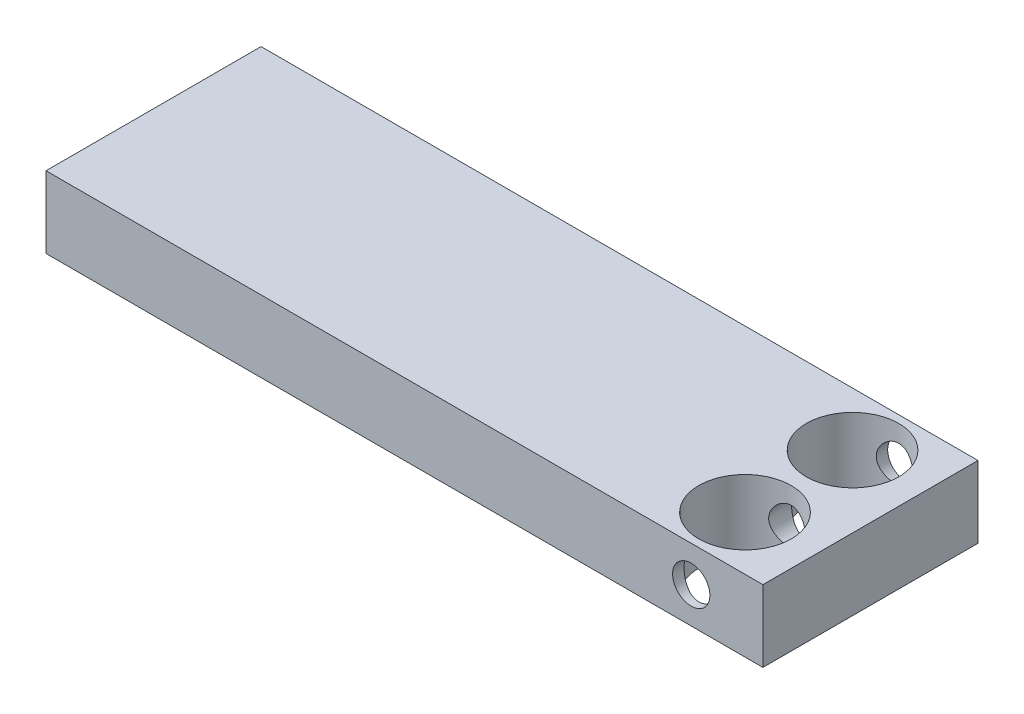
ISO-10303-21;
HEADER;
FILE_DESCRIPTION(('STEP AP214'),'2;1');
FILE_NAME('part.step','',(''),(''),'','','');
FILE_SCHEMA(('AUTOMOTIVE_DESIGN { 1 0 10303 214 1 1 1 1 }'));
ENDSEC;
DATA;
#1=APPLICATION_CONTEXT('core data for automotive mechanical design processes');
#2=APPLICATION_PROTOCOL_DEFINITION('international standard','automotive_design',2000,#1);
#3=PRODUCT_CONTEXT('',#1,'mechanical');
#4=PRODUCT('Part','Part','',(#3));
#5=PRODUCT_RELATED_PRODUCT_CATEGORY('part','',(#4));
#6=PRODUCT_DEFINITION_FORMATION('','',#4);
#7=PRODUCT_DEFINITION_CONTEXT('part definition',#1,'design');
#8=PRODUCT_DEFINITION('design','',#6,#7);
#9=PRODUCT_DEFINITION_SHAPE('','',#8);
#10=(LENGTH_UNIT() NAMED_UNIT(*) SI_UNIT(.MILLI.,.METRE.));
#11=(NAMED_UNIT(*) PLANE_ANGLE_UNIT() SI_UNIT($,.RADIAN.));
#12=(NAMED_UNIT(*) SI_UNIT($,.STERADIAN.) SOLID_ANGLE_UNIT());
#13=UNCERTAINTY_MEASURE_WITH_UNIT(LENGTH_MEASURE(1.E-05),#10,'distance_accuracy_value','');
#14=(GEOMETRIC_REPRESENTATION_CONTEXT(3) GLOBAL_UNCERTAINTY_ASSIGNED_CONTEXT((#13)) GLOBAL_UNIT_ASSIGNED_CONTEXT((#10,
#11,#12)) REPRESENTATION_CONTEXT('',''));
#15=CARTESIAN_POINT('',(0.,0.,0.));
#16=DIRECTION('',(0.,0.,1.));
#17=DIRECTION('',(1.,0.,0.));
#18=AXIS2_PLACEMENT_3D('',#15,#16,#17);
#19=CARTESIAN_POINT('',(0.,10.,0.));
#20=DIRECTION('',(0.,1.,0.));
#21=DIRECTION('',(0.,0.,1.));
#22=AXIS2_PLACEMENT_3D('',#19,#20,#21);
#23=PLANE('',#22);
#24=CARTESIAN_POINT('',(65.1891074130106,10.,-11.5695915279879));
#25=DIRECTION('',(0.,1.,0.));
#26=DIRECTION('',(0.,0.,1.));
#27=AXIS2_PLACEMENT_3D('',#24,#25,#26);
#28=CIRCLE('',#27,6.45);
#29=CARTESIAN_POINT('',(65.1891074130106,10.,-5.11959152798789));
#30=VERTEX_POINT('',#29);
#31=EDGE_CURVE('E126',#30,#30,#28,.T.);
#32=ORIENTED_EDGE('',*,*,#31,.F.);
#33=EDGE_LOOP('',(#32));
#34=FACE_BOUND('',#33,.T.);
#35=DIRECTION('',(0.,0.,1.));
#36=VECTOR('',#35,1.);
#37=CARTESIAN_POINT('',(-24.8108925869894,10.,-19.0695915279879));
#38=LINE('',#37,#36);
#39=CARTESIAN_POINT('',(-24.8108925869894,10.,-19.0695915279879));
#40=VERTEX_POINT('',#39);
#41=CARTESIAN_POINT('',(-24.8108925869894,10.,10.9304084720121));
#42=VERTEX_POINT('',#41);
#43=EDGE_CURVE('E105',#40,#42,#38,.T.);
#44=ORIENTED_EDGE('',*,*,#43,.T.);
#45=DIRECTION('',(1.,0.,0.));
#46=VECTOR('',#45,1.);
#47=CARTESIAN_POINT('',(-24.8108925869894,10.,10.9304084720121));
#48=LINE('',#47,#46);
#49=CARTESIAN_POINT('',(75.1891074130106,10.,10.9304084720121));
#50=VERTEX_POINT('',#49);
#51=EDGE_CURVE('E100',#42,#50,#48,.T.);
#52=ORIENTED_EDGE('',*,*,#51,.T.);
#53=DIRECTION('',(0.,0.,-1.));
#54=VECTOR('',#53,1.);
#55=CARTESIAN_POINT('',(75.1891074130106,10.,-19.0695915279879));
#56=LINE('',#55,#54);
#57=CARTESIAN_POINT('',(75.1891074130106,10.,-19.0695915279879));
#58=VERTEX_POINT('',#57);
#59=EDGE_CURVE('E103',#50,#58,#56,.T.);
#60=ORIENTED_EDGE('',*,*,#59,.T.);
#61=DIRECTION('',(-1.,0.,0.));
#62=VECTOR('',#61,1.);
#63=CARTESIAN_POINT('',(-24.8108925869894,10.,-19.0695915279879));
#64=LINE('',#63,#62);
#65=EDGE_CURVE('E70',#58,#40,#64,.T.);
#66=ORIENTED_EDGE('',*,*,#65,.T.);
#67=EDGE_LOOP('',(#44,#52,#60,#66));
#68=FACE_BOUND('',#67,.T.);
#69=CARTESIAN_POINT('',(65.1891074130106,10.,3.4304084720121));
#70=DIRECTION('',(0.,1.,0.));
#71=DIRECTION('',(0.,0.,1.));
#72=AXIS2_PLACEMENT_3D('',#69,#70,#71);
#73=CIRCLE('',#72,6.45);
#74=CARTESIAN_POINT('',(65.1891074130106,10.,9.88040847201211));
#75=VERTEX_POINT('',#74);
#76=EDGE_CURVE('E215',#75,#75,#73,.T.);
#77=ORIENTED_EDGE('',*,*,#76,.F.);
#78=EDGE_LOOP('',(#77));
#79=FACE_BOUND('',#78,.T.);
#80=ADVANCED_FACE('F45',(#34,#68,#79),#23,.T.);
#81=CARTESIAN_POINT('',(0.,0.,0.));
#82=DIRECTION('',(0.,1.,0.));
#83=DIRECTION('',(0.,0.,1.));
#84=AXIS2_PLACEMENT_3D('',#81,#82,#83);
#85=PLANE('',#84);
#86=DIRECTION('',(0.,0.,1.));
#87=VECTOR('',#86,1.);
#88=CARTESIAN_POINT('',(-24.8108925869894,0.,-19.0695915279879));
#89=LINE('',#88,#87);
#90=CARTESIAN_POINT('',(-24.8108925869894,0.,-19.0695915279879));
#91=VERTEX_POINT('',#90);
#92=CARTESIAN_POINT('',(-24.8108925869894,0.,10.9304084720121));
#93=VERTEX_POINT('',#92);
#94=EDGE_CURVE('E122',#91,#93,#89,.T.);
#95=ORIENTED_EDGE('',*,*,#94,.F.);
#96=DIRECTION('',(-1.,0.,0.));
#97=VECTOR('',#96,1.);
#98=CARTESIAN_POINT('',(-24.8108925869894,0.,-19.0695915279879));
#99=LINE('',#98,#97);
#100=CARTESIAN_POINT('',(75.1891074130106,0.,-19.0695915279879));
#101=VERTEX_POINT('',#100);
#102=EDGE_CURVE('E93',#101,#91,#99,.T.);
#103=ORIENTED_EDGE('',*,*,#102,.F.);
#104=DIRECTION('',(0.,0.,-1.));
#105=VECTOR('',#104,1.);
#106=CARTESIAN_POINT('',(75.1891074130106,0.,-19.0695915279879));
#107=LINE('',#106,#105);
#108=CARTESIAN_POINT('',(75.1891074130106,0.,10.9304084720121));
#109=VERTEX_POINT('',#108);
#110=EDGE_CURVE('E87',#109,#101,#107,.T.);
#111=ORIENTED_EDGE('',*,*,#110,.F.);
#112=DIRECTION('',(1.,0.,0.));
#113=VECTOR('',#112,1.);
#114=CARTESIAN_POINT('',(-24.8108925869894,0.,10.9304084720121));
#115=LINE('',#114,#113);
#116=EDGE_CURVE('E110',#93,#109,#115,.T.);
#117=ORIENTED_EDGE('',*,*,#116,.F.);
#118=EDGE_LOOP('',(#95,#103,#111,#117));
#119=FACE_BOUND('',#118,.T.);
#120=CARTESIAN_POINT('',(65.1891074130106,0.,-11.5695915279879));
#121=DIRECTION('',(0.,1.,0.));
#122=DIRECTION('',(0.,0.,1.));
#123=AXIS2_PLACEMENT_3D('',#120,#121,#122);
#124=CIRCLE('',#123,6.45);
#125=CARTESIAN_POINT('',(65.1891074130106,0.,-5.11959152798789));
#126=VERTEX_POINT('',#125);
#127=EDGE_CURVE('E221',#126,#126,#124,.T.);
#128=ORIENTED_EDGE('',*,*,#127,.T.);
#129=EDGE_LOOP('',(#128));
#130=FACE_BOUND('',#129,.T.);
#131=CARTESIAN_POINT('',(65.1891074130106,0.,3.4304084720121));
#132=DIRECTION('',(0.,1.,0.));
#133=DIRECTION('',(0.,0.,1.));
#134=AXIS2_PLACEMENT_3D('',#131,#132,#133);
#135=CIRCLE('',#134,6.45);
#136=CARTESIAN_POINT('',(65.1891074130106,0.,9.88040847201211));
#137=VERTEX_POINT('',#136);
#138=EDGE_CURVE('E212',#137,#137,#135,.T.);
#139=ORIENTED_EDGE('',*,*,#138,.T.);
#140=EDGE_LOOP('',(#139));
#141=FACE_BOUND('',#140,.T.);
#142=ADVANCED_FACE('F180',(#119,#130,#141),#85,.F.);
#143=CARTESIAN_POINT('',(-24.8108925869894,10.,-19.0695915279879));
#144=DIRECTION('',(1.,0.,0.));
#145=DIRECTION('',(0.,0.,-1.));
#146=AXIS2_PLACEMENT_3D('',#143,#144,#145);
#147=PLANE('',#146);
#148=ORIENTED_EDGE('',*,*,#94,.T.);
#149=DIRECTION('',(0.,-1.,0.));
#150=VECTOR('',#149,1.);
#151=CARTESIAN_POINT('',(-24.8108925869894,10.,10.9304084720121));
#152=LINE('',#151,#150);
#153=EDGE_CURVE('E11',#42,#93,#152,.T.);
#154=ORIENTED_EDGE('',*,*,#153,.F.);
#155=ORIENTED_EDGE('',*,*,#43,.F.);
#156=DIRECTION('',(0.,-1.,0.));
#157=VECTOR('',#156,1.);
#158=CARTESIAN_POINT('',(-24.8108925869894,10.,-19.0695915279879));
#159=LINE('',#158,#157);
#160=EDGE_CURVE('E118',#40,#91,#159,.T.);
#161=ORIENTED_EDGE('',*,*,#160,.T.);
#162=EDGE_LOOP('',(#148,#154,#155,#161));
#163=FACE_BOUND('',#162,.T.);
#164=ADVANCED_FACE('F47',(#163),#147,.F.);
#165=CARTESIAN_POINT('',(-24.8108925869894,10.,10.9304084720121));
#166=DIRECTION('',(0.,0.,-1.));
#167=DIRECTION('',(-1.,0.,0.));
#168=AXIS2_PLACEMENT_3D('',#165,#166,#167);
#169=PLANE('',#168);
#170=CARTESIAN_POINT('',(65.1891074130106,5.,10.9304084720121));
#171=DIRECTION('',(0.,0.,1.));
#172=DIRECTION('',(1.,0.,0.));
#173=AXIS2_PLACEMENT_3D('',#170,#171,#172);
#174=CIRCLE('',#173,2.6);
#175=CARTESIAN_POINT('',(67.7891074130106,5.,10.9304084720121));
#176=VERTEX_POINT('',#175);
#177=EDGE_CURVE('E165',#176,#176,#174,.T.);
#178=ORIENTED_EDGE('',*,*,#177,.F.);
#179=EDGE_LOOP('',(#178));
#180=FACE_BOUND('',#179,.T.);
#181=ORIENTED_EDGE('',*,*,#116,.T.);
#182=DIRECTION('',(0.,-1.,0.));
#183=VECTOR('',#182,1.);
#184=CARTESIAN_POINT('',(75.1891074130106,10.,10.9304084720121));
#185=LINE('',#184,#183);
#186=EDGE_CURVE('E61',#50,#109,#185,.T.);
#187=ORIENTED_EDGE('',*,*,#186,.F.);
#188=ORIENTED_EDGE('',*,*,#51,.F.);
#189=ORIENTED_EDGE('',*,*,#153,.T.);
#190=EDGE_LOOP('',(#181,#187,#188,#189));
#191=FACE_BOUND('',#190,.T.);
#192=ADVANCED_FACE('F109',(#180,#191),#169,.F.);
#193=CARTESIAN_POINT('',(75.1891074130106,10.,-19.0695915279879));
#194=DIRECTION('',(-1.,0.,0.));
#195=DIRECTION('',(0.,0.,1.));
#196=AXIS2_PLACEMENT_3D('',#193,#194,#195);
#197=PLANE('',#196);
#198=ORIENTED_EDGE('',*,*,#110,.T.);
#199=DIRECTION('',(0.,-1.,0.));
#200=VECTOR('',#199,1.);
#201=CARTESIAN_POINT('',(75.1891074130106,10.,-19.0695915279879));
#202=LINE('',#201,#200);
#203=EDGE_CURVE('E112',#58,#101,#202,.T.);
#204=ORIENTED_EDGE('',*,*,#203,.F.);
#205=ORIENTED_EDGE('',*,*,#59,.F.);
#206=ORIENTED_EDGE('',*,*,#186,.T.);
#207=EDGE_LOOP('',(#198,#204,#205,#206));
#208=FACE_BOUND('',#207,.T.);
#209=ADVANCED_FACE('F114',(#208),#197,.F.);
#210=CARTESIAN_POINT('',(-24.8108925869894,10.,-19.0695915279879));
#211=DIRECTION('',(0.,0.,1.));
#212=DIRECTION('',(1.,0.,0.));
#213=AXIS2_PLACEMENT_3D('',#210,#211,#212);
#214=PLANE('',#213);
#215=CARTESIAN_POINT('',(65.1891074130106,5.,-19.0695915279879));
#216=DIRECTION('',(0.,0.,1.));
#217=DIRECTION('',(1.,0.,0.));
#218=AXIS2_PLACEMENT_3D('',#215,#216,#217);
#219=CIRCLE('',#218,2.6);
#220=CARTESIAN_POINT('',(67.7891074130106,5.,-19.0695915279879));
#221=VERTEX_POINT('',#220);
#222=EDGE_CURVE('E142',#221,#221,#219,.T.);
#223=ORIENTED_EDGE('',*,*,#222,.T.);
#224=EDGE_LOOP('',(#223));
#225=FACE_BOUND('',#224,.T.);
#226=ORIENTED_EDGE('',*,*,#102,.T.);
#227=ORIENTED_EDGE('',*,*,#160,.F.);
#228=ORIENTED_EDGE('',*,*,#65,.F.);
#229=ORIENTED_EDGE('',*,*,#203,.T.);
#230=EDGE_LOOP('',(#226,#227,#228,#229));
#231=FACE_BOUND('',#230,.T.);
#232=ADVANCED_FACE('F175',(#225,#231),#214,.F.);
#233=CARTESIAN_POINT('',(65.1891074130106,10.,-11.5695915279879));
#234=DIRECTION('',(0.,-1.,0.));
#235=DIRECTION('',(0.,0.,-1.));
#236=AXIS2_PLACEMENT_3D('',#233,#234,#235);
#237=CYLINDRICAL_SURFACE('',#236,6.45);
#238=CARTESIAN_POINT('',(65.1891074130106,7.6,-18.0195915279879));
#239=CARTESIAN_POINT('',(65.049443953852,7.59999038205518,-18.0195843580053));
#240=CARTESIAN_POINT('',(64.9095571171709,7.58868190361171,-18.0150034801927));
#241=CARTESIAN_POINT('',(64.6337226361947,7.54385000863757,-17.997131215911));
#242=CARTESIAN_POINT('',(64.4977866604626,7.51026663301929,-17.9838163204712));
#243=CARTESIAN_POINT('',(64.234299894891,7.42230490553846,-17.949907052448));
#244=CARTESIAN_POINT('',(64.1067230799437,7.3679950780569,-17.9293366842168));
#245=CARTESIAN_POINT('',(63.8626080057299,7.24039717036633,-17.8829390925762));
#246=CARTESIAN_POINT('',(63.7460660230957,7.16711552300965,-17.8571136516598));
#247=CARTESIAN_POINT('',(63.5216013269245,6.999961359434,-17.8014351658519));
#248=CARTESIAN_POINT('',(63.4142737252579,6.90533207510747,-17.771455821893));
#249=CARTESIAN_POINT('',(63.2165068647384,6.69976662799704,-17.7114194154175));
#250=CARTESIAN_POINT('',(63.1260759812327,6.58882242668424,-17.681362321806));
#251=CARTESIAN_POINT('',(62.960627763423,6.34766760376749,-17.6230560018294));
#252=CARTESIAN_POINT('',(62.886495538866,6.21681137237152,-17.5949506019737));
#253=CARTESIAN_POINT('',(62.7615592921506,5.94318549034433,-17.5457151290368));
#254=CARTESIAN_POINT('',(62.7107440175874,5.80042162554914,-17.5245816927789));
#255=CARTESIAN_POINT('',(62.6363002936671,5.51387366656594,-17.4930408704263));
#256=CARTESIAN_POINT('',(62.6115313872506,5.37043695143929,-17.4821858232377));
#257=CARTESIAN_POINT('',(62.5863217819684,5.08106402109816,-17.4711350804457));
#258=CARTESIAN_POINT('',(62.5858688615339,4.93512909841648,-17.470934029989));
#259=CARTESIAN_POINT('',(62.6084407817256,4.65593369999567,-17.4808326670544));
#260=CARTESIAN_POINT('',(62.6298039418199,4.52250798222447,-17.4902033131464));
#261=CARTESIAN_POINT('',(62.6926278960884,4.26132657685323,-17.5169643409818));
#262=CARTESIAN_POINT('',(62.7340922579733,4.13357190018719,-17.5343561463535));
#263=CARTESIAN_POINT('',(62.8367349151368,3.88424953516467,-17.5755839625208));
#264=CARTESIAN_POINT('',(62.8983013412019,3.76286327088355,-17.5995452225451));
#265=CARTESIAN_POINT('',(63.0391276532907,3.53169384308052,-17.6511786598746));
#266=CARTESIAN_POINT('',(63.1183942487707,3.4219151028398,-17.678852242787));
#267=CARTESIAN_POINT('',(63.2996936754202,3.20799491897171,-17.73744138955));
#268=CARTESIAN_POINT('',(63.403026373815,3.10497510205692,-17.7684407910024));
#269=CARTESIAN_POINT('',(63.6258276909497,2.91736446848621,-17.8283416519687));
#270=CARTESIAN_POINT('',(63.745299615479,2.83277743670824,-17.8572426798044));
#271=CARTESIAN_POINT('',(64.0002109648098,2.68293035090452,-17.9104349103072));
#272=CARTESIAN_POINT('',(64.1359258075427,2.61809853864812,-17.9346203577483));
#273=CARTESIAN_POINT('',(64.4175579961948,2.51257330178059,-17.9748546585176));
#274=CARTESIAN_POINT('',(64.5634700322478,2.47186741751902,-17.9909077111352));
#275=CARTESIAN_POINT('',(64.8519582471226,2.4180324243259,-18.012299628453));
#276=CARTESIAN_POINT('',(64.9942099931984,2.40339637007281,-18.0182231196967));
#277=CARTESIAN_POINT('',(65.2792469080506,2.39765895008397,-18.0205345721821));
#278=CARTESIAN_POINT('',(65.4220319259364,2.40655136631826,-18.0169250527783));
#279=CARTESIAN_POINT('',(65.6972103846443,2.44651564696349,-18.0009581348049));
#280=CARTESIAN_POINT('',(65.8297802947438,2.47655343873652,-17.9890088029702));
#281=CARTESIAN_POINT('',(66.0878720654806,2.5565428899223,-17.9579895266322));
#282=CARTESIAN_POINT('',(66.2133930207913,2.60649710064067,-17.9389186698771));
#283=CARTESIAN_POINT('',(66.4581616127702,2.72653280691076,-17.894775301751));
#284=CARTESIAN_POINT('',(66.5770984028332,2.79718507198959,-17.869536529751));
#285=CARTESIAN_POINT('',(66.8018475132868,2.95597928984145,-17.815785890299));
#286=CARTESIAN_POINT('',(66.9076545011461,3.04412831120112,-17.7872727019705));
#287=CARTESIAN_POINT('',(67.1105833428669,3.24234015980941,-17.7277044774056));
#288=CARTESIAN_POINT('',(67.2066476601627,3.35347580481171,-17.6966071702805));
#289=CARTESIAN_POINT('',(67.3790293002472,3.59083075699924,-17.6371346067737));
#290=CARTESIAN_POINT('',(67.4553431554437,3.7170527072108,-17.6087598289364));
#291=CARTESIAN_POINT('',(67.5865996643826,3.9830248406539,-17.5578769165861));
#292=CARTESIAN_POINT('',(67.6413099429467,4.12290294784877,-17.5354333874922));
#293=CARTESIAN_POINT('',(67.725968349677,4.41106643119875,-17.4999358499431));
#294=CARTESIAN_POINT('',(67.7559351420714,4.55934538013498,-17.4868747651968));
#295=CARTESIAN_POINT('',(67.7884596780049,4.84845203882011,-17.4726546045068));
#296=CARTESIAN_POINT('',(67.7928564756204,4.98903481178427,-17.4706972015316));
#297=CARTESIAN_POINT('',(67.7789603350287,5.26883807785537,-17.4768091234438));
#298=CARTESIAN_POINT('',(67.7606703804531,5.40805874767155,-17.4848771298471));
#299=CARTESIAN_POINT('',(67.7034299141594,5.67536165887292,-17.5094218291222));
#300=CARTESIAN_POINT('',(67.665352500826,5.80366659880845,-17.5255421394483));
#301=CARTESIAN_POINT('',(67.5704416775437,6.05211432633003,-17.5641188497917));
#302=CARTESIAN_POINT('',(67.5136030702548,6.17225484102351,-17.586577005307));
#303=CARTESIAN_POINT('',(67.3789879300964,6.40853308097918,-17.6369108354267));
#304=CARTESIAN_POINT('',(67.3001908753141,6.52403782754706,-17.6650246525093));
#305=CARTESIAN_POINT('',(67.125378871435,6.74076203686455,-17.7227876387213));
#306=CARTESIAN_POINT('',(67.0293585860568,6.8419770548025,-17.7524372816658));
#307=CARTESIAN_POINT('',(66.8152414769772,7.03413649739573,-17.8122928618691));
#308=CARTESIAN_POINT('',(66.6961032555743,7.12395558230192,-17.8424054235132));
#309=CARTESIAN_POINT('',(66.4433472473467,7.282355522309,-17.8977925735713));
#310=CARTESIAN_POINT('',(66.3097227976417,7.35092654803047,-17.9230649208375));
#311=CARTESIAN_POINT('',(66.033991251297,7.46330470158073,-17.9655033180189));
#312=CARTESIAN_POINT('',(65.8920839658472,7.50754176081678,-17.9828091580173));
#313=CARTESIAN_POINT('',(65.6749045080477,7.55529109649309,-18.0016848086538));
#314=CARTESIAN_POINT('',(65.6018588872583,7.56810332989693,-18.0067947592734));
#315=CARTESIAN_POINT('',(65.4548229825672,7.5874453795977,-18.0145341780799));
#316=CARTESIAN_POINT('',(65.3808333985522,7.59397960424013,-18.0171653867854));
#317=CARTESIAN_POINT('',(65.2675408446318,7.5991141380437,-18.0192347771974));
#318=CARTESIAN_POINT('',(65.2283329389333,7.60000270127166,-18.0195935417311));
#319=CARTESIAN_POINT('',(65.1891074130106,7.6,-18.0195915279879));
#320=B_SPLINE_CURVE_WITH_KNOTS('',3,(#238,#239,#240,#241,#242,#243,#244,#245,#246,#247,#248,
#249,#250,#251,#252,#253,#254,#255,#256,#257,#258,#259,#260,#261,#262,#263,#264,#265,#266,#267,
#268,#269,#270,#271,#272,#273,#274,#275,#276,#277,#278,#279,#280,#281,#282,#283,#284,#285,#286,
#287,#288,#289,#290,#291,#292,#293,#294,#295,#296,#297,#298,#299,#300,#301,#302,#303,#304,#305,
#306,#307,#308,#309,#310,#311,#312,#313,#314,#315,#316,#317,#318,#319),.UNSPECIFIED.,.T.,.F.,(4,
2,2,2,2,2,2,2,2,2,2,2,2,2,2,2,2,2,2,2,2,2,2,2,2,2,2,2,2,2,2,2,2,2,2,2,2,2,2,2,4),(0.,
0.418858326151934,0.838848726759475,1.25746244707873,1.67593441181777,2.11260203339347,
2.54948553101387,3.00618397254462,3.46266178597057,3.89819456581586,4.33350843848996,
4.73797001017695,5.14250339500799,5.55536162095003,5.9683766121018,6.41386047177645,
6.85943571843233,7.31407662841736,7.76848253753773,8.19564651828704,8.62269762076302,
9.03019719641802,9.43774898980224,9.85781126699111,10.2780435935428,10.7264437075414,
11.1749224939023,11.6281017949149,12.0809389457233,12.5007605292068,12.9205269060164,
13.3231724715384,13.7259296741311,14.1519718080368,14.5781461714998,15.0325667126686,
15.4871971566108,15.9335136685707,16.1562736266749,16.3788770507334,16.4965165409007),.UNSPECIFIED.);
#321=CARTESIAN_POINT('',(65.1891074130106,7.6,-18.0195915279879));
#322=VERTEX_POINT('',#321);
#323=EDGE_CURVE('E164',#322,#322,#320,.T.);
#324=ORIENTED_EDGE('',*,*,#323,.F.);
#325=EDGE_LOOP('',(#324));
#326=FACE_BOUND('',#325,.T.);
#327=CARTESIAN_POINT('',(67.7891074130106,5.,-5.66683793326619));
#328=CARTESIAN_POINT('',(67.7891058259926,4.93039622589026,-5.66683659105084));
#329=CARTESIAN_POINT('',(67.7863064377443,4.86076733361563,-5.66560110426344));
#330=CARTESIAN_POINT('',(67.7751449531052,4.72202920294245,-5.66070513423825));
#331=CARTESIAN_POINT('',(67.7667792873088,4.6529203267836,-5.65704309496675));
#332=CARTESIAN_POINT('',(67.7333903866728,4.44686300764135,-5.64255475965501));
#333=CARTESIAN_POINT('',(67.7000755496985,4.31139821329843,-5.62822676517833));
#334=CARTESIAN_POINT('',(67.6128984495522,4.04904336574641,-5.59214123804025));
#335=CARTESIAN_POINT('',(67.5591162994591,3.9221221225568,-5.57041270692393));
#336=CARTESIAN_POINT('',(67.4327655515697,3.67911223953199,-5.52202487117607));
#337=CARTESIAN_POINT('',(67.360202238471,3.56302056492265,-5.49536695419087));
#338=CARTESIAN_POINT('',(67.1938342203719,3.33817875053167,-5.4383856616361));
#339=CARTESIAN_POINT('',(67.099111373906,3.23013828926417,-5.40794313746794));
#340=CARTESIAN_POINT('',(66.8930437695272,3.03095339599392,-5.34780600959959));
#341=CARTESIAN_POINT('',(66.7816928654231,2.93981523959622,-5.3181116872189));
#342=CARTESIAN_POINT('',(66.5400383091585,2.77349095357243,-5.26138453570245));
#343=CARTESIAN_POINT('',(66.4091533085589,2.69909197233702,-5.23450638090951));
#344=CARTESIAN_POINT('',(66.1354480953381,2.57367107400323,-5.18788583645197));
#345=CARTESIAN_POINT('',(65.9926328893796,2.52263940821131,-5.16814047176035));
#346=CARTESIAN_POINT('',(65.7065565034584,2.4479390000001,-5.13885342393188));
#347=CARTESIAN_POINT('',(65.5636612393948,2.42305020100064,-5.12885850331196));
#348=CARTESIAN_POINT('',(65.2753962663659,2.39741081965101,-5.11855880677416));
#349=CARTESIAN_POINT('',(65.1300275144753,2.39665110430951,-5.11825036447126));
#350=CARTESIAN_POINT('',(64.8497709307241,2.41862802901505,-5.12708422177769));
#351=CARTESIAN_POINT('',(64.7147581654071,2.44002716951666,-5.1356885594942));
#352=CARTESIAN_POINT('',(64.4504288997464,2.50343610538917,-5.16065354697405));
#353=CARTESIAN_POINT('',(64.3211128183399,2.545447413842,-5.17701476614552));
#354=CARTESIAN_POINT('',(64.0695083090568,2.64940163141033,-5.21620911005834));
#355=CARTESIAN_POINT('',(63.94735566079,2.71163623022827,-5.23913632663314));
#356=CARTESIAN_POINT('',(63.7149112895122,2.85399491426008,-5.28919318361042));
#357=CARTESIAN_POINT('',(63.604623677076,2.93412516993975,-5.31632427252784));
#358=CARTESIAN_POINT('',(63.3912465052019,3.11621333012426,-5.37417226565859));
#359=CARTESIAN_POINT('',(63.2891244462782,3.21926898424482,-5.40500764491262));
#360=CARTESIAN_POINT('',(63.1032117370748,3.44115447804794,-5.46540320412764));
#361=CARTESIAN_POINT('',(63.0194272779334,3.55998962351098,-5.49496295071384));
#362=CARTESIAN_POINT('',(62.8703062990834,3.81445269128155,-5.55027358526758));
#363=CARTESIAN_POINT('',(62.8055768546655,3.9504683521267,-5.57588877208968));
#364=CARTESIAN_POINT('',(62.7003282010056,4.23277697379599,-5.61881449411658));
#365=CARTESIAN_POINT('',(62.6597929766374,4.37906306436606,-5.63613052136935));
#366=CARTESIAN_POINT('',(62.6064565522163,4.66809990366188,-5.65915903133381));
#367=CARTESIAN_POINT('',(62.5920959877293,4.81051029687909,-5.66552256877082));
#368=CARTESIAN_POINT('',(62.5869626115139,5.09581719468189,-5.66778167519744));
#369=CARTESIAN_POINT('',(62.5961824704824,5.23871353443705,-5.66368049684679));
#370=CARTESIAN_POINT('',(62.63652779538,5.5121851947789,-5.6461412814451));
#371=CARTESIAN_POINT('',(62.6663465738066,5.64299347094675,-5.63326077670686));
#372=CARTESIAN_POINT('',(62.7453414905153,5.89765961446308,-5.60030965580591));
#373=CARTESIAN_POINT('',(62.7945219637004,6.02151591822957,-5.5802374295744));
#374=CARTESIAN_POINT('',(62.9130876634884,6.26441427744971,-5.5341607151619));
#375=CARTESIAN_POINT('',(62.9832170711336,6.38305217168714,-5.5079471542809));
#376=CARTESIAN_POINT('',(63.1409329432458,6.60742146812071,-5.45285618306634));
#377=CARTESIAN_POINT('',(63.2285266004614,6.71314752347716,-5.42397767780168));
#378=CARTESIAN_POINT('',(63.4264623287042,6.91696180428627,-5.36418751692306));
#379=CARTESIAN_POINT('',(63.5380200612119,7.0138769770192,-5.33328635631929));
#380=CARTESIAN_POINT('',(63.77654956188,7.18779864948334,-5.27497183079765));
#381=CARTESIAN_POINT('',(63.9035220481827,7.26480422114296,-5.24755862849867));
#382=CARTESIAN_POINT('',(64.1698023003659,7.39647027001733,-5.19920622302409));
#383=CARTESIAN_POINT('',(64.3091130152542,7.45112538753349,-5.17826857299623));
#384=CARTESIAN_POINT('',(64.5960048721061,7.53585620873891,-5.14529957504812));
#385=CARTESIAN_POINT('',(64.743581393711,7.56594550038312,-5.13326330390647));
#386=CARTESIAN_POINT('',(65.0322924518335,7.59906007277215,-5.11998632546349));
#387=CARTESIAN_POINT('',(65.1732078817726,7.60374304603838,-5.11808452955179));
#388=CARTESIAN_POINT('',(65.4537512032902,7.59030415205942,-5.12349695492731));
#389=CARTESIAN_POINT('',(65.5933792924638,7.57218584534272,-5.13080973731446));
#390=CARTESIAN_POINT('',(65.8628602605304,7.51484484827699,-5.1534956559538));
#391=CARTESIAN_POINT('',(65.9928825844937,7.4763065763059,-5.16860700201114));
#392=CARTESIAN_POINT('',(66.2445889450508,7.37994347024277,-5.2052650699778));
#393=CARTESIAN_POINT('',(66.3662713426169,7.32211485808885,-5.22681305243215));
#394=CARTESIAN_POINT('',(66.6037873615646,7.18592029624104,-5.27542520451977));
#395=CARTESIAN_POINT('',(66.7191208085767,7.10675592688043,-5.30269194568892));
#396=CARTESIAN_POINT('',(66.9353450463544,6.93133510811346,-5.35946505391593));
#397=CARTESIAN_POINT('',(67.0362309034898,6.835072845059,-5.38897218079267));
#398=CARTESIAN_POINT('',(67.2272784607839,6.62101759950107,-5.44921397335447));
#399=CARTESIAN_POINT('',(67.3163666895405,6.50225127781417,-5.47990913269188));
#400=CARTESIAN_POINT('',(67.473470077258,6.25049133148065,-5.53707973558937));
#401=CARTESIAN_POINT('',(67.541473823677,6.11749005399,-5.56355289012463));
#402=CARTESIAN_POINT('',(67.6535263647848,5.8417398179687,-5.60865151050292));
#403=CARTESIAN_POINT('',(67.697782134957,5.69908770321674,-5.62734445237249));
#404=CARTESIAN_POINT('',(67.7453734335789,5.4806981629438,-5.64774441755747));
#405=CARTESIAN_POINT('',(67.7581018960382,5.40723929233944,-5.65326950799169));
#406=CARTESIAN_POINT('',(67.777208931447,5.25936468014916,-5.66160127109101));
#407=CARTESIAN_POINT('',(67.7835922207705,5.18494969098617,-5.66440996281619));
#408=CARTESIAN_POINT('',(67.7883263260083,5.07362560028069,-5.6664940655042));
#409=CARTESIAN_POINT('',(67.78910825245,5.0368163139072,-5.66683864321938));
#410=CARTESIAN_POINT('',(67.7891074130106,5.,-5.66683793326619));
#411=B_SPLINE_CURVE_WITH_KNOTS('',3,(#327,#328,#329,#330,#331,#332,#333,#334,#335,#336,#337,
#338,#339,#340,#341,#342,#343,#344,#345,#346,#347,#348,#349,#350,#351,#352,#353,#354,#355,#356,
#357,#358,#359,#360,#361,#362,#363,#364,#365,#366,#367,#368,#369,#370,#371,#372,#373,#374,#375,
#376,#377,#378,#379,#380,#381,#382,#383,#384,#385,#386,#387,#388,#389,#390,#391,#392,#393,#394,
#395,#396,#397,#398,#399,#400,#401,#402,#403,#404,#405,#406,#407,#408,#409,#410),.UNSPECIFIED.,
.T.,.F.,(4,2,2,2,2,2,2,2,2,2,2,2,2,2,2,2,2,2,2,2,2,2,2,2,2,2,2,2,2,2,2,2,2,2,2,2,2,2,2,2,2,4),
(0.,0.20878025038681,0.417694511436456,0.836157397968941,1.25299891058499,1.66972325841475,
2.10841662826191,2.54727255455877,3.00374397766062,3.46002478992618,3.89391110017773,
4.32763318010816,4.73662058428681,5.14563801558647,5.56083821872573,5.97618180553607,
6.41916683088422,6.86230118686253,7.31831727587143,7.77403117378064,8.20157763136727,
8.6289912144668,9.03151907271619,9.43413710449764,9.85322411010326,10.272484076908,
10.7232866906059,11.1741103143531,11.6250419835029,12.0757240620905,12.4966116075007,
12.9174334374697,13.3249681233629,13.7325826728628,14.158310207234,14.5841827761211,
15.036838657487,15.4897391249748,15.93862544347,16.1626374861386,16.3864828956206,
16.4969154021072),.UNSPECIFIED.);
#412=CARTESIAN_POINT('',(67.7891074130106,5.,-5.66683793326619));
#413=VERTEX_POINT('',#412);
#414=EDGE_CURVE('E157',#413,#413,#411,.T.);
#415=ORIENTED_EDGE('',*,*,#414,.F.);
#416=EDGE_LOOP('',(#415));
#417=FACE_BOUND('',#416,.T.);
#418=ORIENTED_EDGE('',*,*,#31,.T.);
#419=EDGE_LOOP('',(#418));
#420=FACE_BOUND('',#419,.T.);
#421=ORIENTED_EDGE('',*,*,#127,.F.);
#422=EDGE_LOOP('',(#421));
#423=FACE_BOUND('',#422,.T.);
#424=ADVANCED_FACE('F171',(#326,#417,#420,#423),#237,.F.);
#425=CARTESIAN_POINT('',(65.1891074130106,10.,3.4304084720121));
#426=DIRECTION('',(0.,-1.,0.));
#427=DIRECTION('',(0.,0.,-1.));
#428=AXIS2_PLACEMENT_3D('',#425,#426,#427);
#429=CYLINDRICAL_SURFACE('',#428,6.45);
#430=CARTESIAN_POINT('',(65.1891074130106,7.6,-3.0195915279879));
#431=CARTESIAN_POINT('',(65.049443953852,7.59999038205518,-3.01958435800534));
#432=CARTESIAN_POINT('',(64.9095571171709,7.58868190361171,-3.0150034801927));
#433=CARTESIAN_POINT('',(64.6337226361947,7.54385000863757,-2.99713121591095));
#434=CARTESIAN_POINT('',(64.4977866604626,7.51026663301929,-2.98381632047119));
#435=CARTESIAN_POINT('',(64.234299894891,7.42230490553846,-2.94990705244801));
#436=CARTESIAN_POINT('',(64.1067230799437,7.3679950780569,-2.92933668421677));
#437=CARTESIAN_POINT('',(63.8626080057299,7.24039717036633,-2.88293909257623));
#438=CARTESIAN_POINT('',(63.7460660230957,7.16711552300965,-2.85711365165983));
#439=CARTESIAN_POINT('',(63.5216013269245,6.999961359434,-2.80143516585186));
#440=CARTESIAN_POINT('',(63.4142737252579,6.90533207510747,-2.771455821893));
#441=CARTESIAN_POINT('',(63.2165068647384,6.69976662799704,-2.71141941541748));
#442=CARTESIAN_POINT('',(63.1260759812327,6.58882242668424,-2.68136232180603));
#443=CARTESIAN_POINT('',(62.960627763423,6.34766760376749,-2.62305600182937));
#444=CARTESIAN_POINT('',(62.886495538866,6.21681137237152,-2.59495060197371));
#445=CARTESIAN_POINT('',(62.7615592921506,5.94318549034433,-2.54571512903684));
#446=CARTESIAN_POINT('',(62.7107440175874,5.80042162554914,-2.52458169277895));
#447=CARTESIAN_POINT('',(62.6363002936671,5.51387366656594,-2.4930408704263));
#448=CARTESIAN_POINT('',(62.6115313872506,5.37043695143929,-2.48218582323772));
#449=CARTESIAN_POINT('',(62.5863217819684,5.08106402109816,-2.47113508044574));
#450=CARTESIAN_POINT('',(62.5858688615339,4.93512909841648,-2.47093402998901));
#451=CARTESIAN_POINT('',(62.6084407817256,4.65593369999567,-2.48083266705438));
#452=CARTESIAN_POINT('',(62.6298039418199,4.52250798222447,-2.49020331314639));
#453=CARTESIAN_POINT('',(62.6926278960884,4.26132657685323,-2.51696434098176));
#454=CARTESIAN_POINT('',(62.7340922579733,4.13357190018719,-2.53435614635345));
#455=CARTESIAN_POINT('',(62.8367349151368,3.88424953516467,-2.57558396252085));
#456=CARTESIAN_POINT('',(62.898301341202,3.76286327088355,-2.5995452225451));
#457=CARTESIAN_POINT('',(63.0391276532908,3.53169384308052,-2.65117865987464));
#458=CARTESIAN_POINT('',(63.1183942487707,3.4219151028398,-2.67885224278697));
#459=CARTESIAN_POINT('',(63.2996936754202,3.2079949189717,-2.73744138954998));
#460=CARTESIAN_POINT('',(63.403026373815,3.10497510205692,-2.76844079100237));
#461=CARTESIAN_POINT('',(63.6258276909497,2.91736446848621,-2.82834165196872));
#462=CARTESIAN_POINT('',(63.745299615479,2.83277743670824,-2.85724267980435));
#463=CARTESIAN_POINT('',(64.0002109648098,2.68293035090452,-2.91043491030716));
#464=CARTESIAN_POINT('',(64.1359258075427,2.61809853864812,-2.93462035774835));
#465=CARTESIAN_POINT('',(64.4175579961948,2.51257330178059,-2.97485465851755));
#466=CARTESIAN_POINT('',(64.5634700322478,2.47186741751902,-2.99090771113515));
#467=CARTESIAN_POINT('',(64.8519582471226,2.4180324243259,-3.01229962845299));
#468=CARTESIAN_POINT('',(64.9942099931985,2.40339637007281,-3.01822311969667));
#469=CARTESIAN_POINT('',(65.2792469080506,2.39765895008397,-3.02053457218209));
#470=CARTESIAN_POINT('',(65.4220319259364,2.40655136631826,-3.01692505277826));
#471=CARTESIAN_POINT('',(65.6972103846443,2.44651564696349,-3.00095813480491));
#472=CARTESIAN_POINT('',(65.8297802947438,2.47655343873652,-2.98900880297019));
#473=CARTESIAN_POINT('',(66.0878720654806,2.5565428899223,-2.95798952663222));
#474=CARTESIAN_POINT('',(66.2133930207913,2.60649710064067,-2.93891866987705));
#475=CARTESIAN_POINT('',(66.4581616127702,2.72653280691076,-2.894775301751));
#476=CARTESIAN_POINT('',(66.5770984028332,2.79718507198959,-2.86953652975103));
#477=CARTESIAN_POINT('',(66.8018475132868,2.95597928984145,-2.81578589029902));
#478=CARTESIAN_POINT('',(66.9076545011461,3.04412831120112,-2.78727270197051));
#479=CARTESIAN_POINT('',(67.1105833428669,3.24234015980941,-2.72770447740557));
#480=CARTESIAN_POINT('',(67.2066476601627,3.35347580481171,-2.69660717028051));
#481=CARTESIAN_POINT('',(67.3790293002472,3.59083075699924,-2.63713460677368));
#482=CARTESIAN_POINT('',(67.4553431554437,3.71705270721081,-2.6087598289364));
#483=CARTESIAN_POINT('',(67.5865996643826,3.98302484065391,-2.55787691658615));
#484=CARTESIAN_POINT('',(67.6413099429467,4.12290294784877,-2.53543338749217));
#485=CARTESIAN_POINT('',(67.725968349677,4.41106643119875,-2.4999358499431));
#486=CARTESIAN_POINT('',(67.7559351420714,4.55934538013498,-2.48687476519676));
#487=CARTESIAN_POINT('',(67.7884596780049,4.84845203882011,-2.47265460450675));
#488=CARTESIAN_POINT('',(67.7928564756204,4.98903481178427,-2.47069720153163));
#489=CARTESIAN_POINT('',(67.7789603350287,5.26883807785537,-2.47680912344384));
#490=CARTESIAN_POINT('',(67.7606703804531,5.40805874767155,-2.48487712984708));
#491=CARTESIAN_POINT('',(67.7034299141594,5.67536165887292,-2.50942182912218));
#492=CARTESIAN_POINT('',(67.665352500826,5.80366659880845,-2.52554213944833));
#493=CARTESIAN_POINT('',(67.5704416775437,6.05211432633004,-2.56411884979169));
#494=CARTESIAN_POINT('',(67.5136030702548,6.17225484102351,-2.58657700530702));
#495=CARTESIAN_POINT('',(67.3789879300964,6.40853308097918,-2.6369108354267));
#496=CARTESIAN_POINT('',(67.3001908753141,6.52403782754706,-2.66502465250927));
#497=CARTESIAN_POINT('',(67.125378871435,6.74076203686455,-2.72278763872134));
#498=CARTESIAN_POINT('',(67.0293585860568,6.8419770548025,-2.75243728166579));
#499=CARTESIAN_POINT('',(66.8152414769772,7.03413649739573,-2.81229286186907));
#500=CARTESIAN_POINT('',(66.6961032555743,7.12395558230192,-2.84240542351318));
#501=CARTESIAN_POINT('',(66.4433472473467,7.282355522309,-2.89779257357129));
#502=CARTESIAN_POINT('',(66.3097227976417,7.35092654803047,-2.92306492083745));
#503=CARTESIAN_POINT('',(66.033991251297,7.46330470158073,-2.96550331801887));
#504=CARTESIAN_POINT('',(65.8920839658472,7.50754176081678,-2.9828091580173));
#505=CARTESIAN_POINT('',(65.6749045080477,7.55529109649309,-3.00168480865377));
#506=CARTESIAN_POINT('',(65.6018588872583,7.56810332989693,-3.0067947592734));
#507=CARTESIAN_POINT('',(65.4548229825672,7.5874453795977,-3.01453417807987));
#508=CARTESIAN_POINT('',(65.3808333985522,7.59397960424013,-3.01716538678541));
#509=CARTESIAN_POINT('',(65.2675408446318,7.5991141380437,-3.01923477719743));
#510=CARTESIAN_POINT('',(65.2283329389333,7.60000270127166,-3.01959354173107));
#511=CARTESIAN_POINT('',(65.1891074130106,7.6,-3.0195915279879));
#512=B_SPLINE_CURVE_WITH_KNOTS('',3,(#430,#431,#432,#433,#434,#435,#436,#437,#438,#439,#440,
#441,#442,#443,#444,#445,#446,#447,#448,#449,#450,#451,#452,#453,#454,#455,#456,#457,#458,#459,
#460,#461,#462,#463,#464,#465,#466,#467,#468,#469,#470,#471,#472,#473,#474,#475,#476,#477,#478,
#479,#480,#481,#482,#483,#484,#485,#486,#487,#488,#489,#490,#491,#492,#493,#494,#495,#496,#497,
#498,#499,#500,#501,#502,#503,#504,#505,#506,#507,#508,#509,#510,#511),.UNSPECIFIED.,.T.,.F.,(4,
2,2,2,2,2,2,2,2,2,2,2,2,2,2,2,2,2,2,2,2,2,2,2,2,2,2,2,2,2,2,2,2,2,2,2,2,2,2,2,4),(0.,
0.418858326151934,0.838848726759475,1.25746244707873,1.67593441181777,2.11260203339347,
2.54948553101387,3.00618397254462,3.46266178597057,3.89819456581586,4.33350843848996,
4.73797001017695,5.14250339500799,5.55536162095003,5.9683766121018,6.41386047177645,
6.85943571843233,7.31407662841736,7.76848253753773,8.19564651828704,8.62269762076302,
9.03019719641802,9.43774898980224,9.85781126699111,10.2780435935428,10.7264437075414,
11.1749224939023,11.6281017949149,12.0809389457233,12.5007605292068,12.9205269060164,
13.3231724715384,13.7259296741311,14.1519718080368,14.5781461714998,15.0325667126686,
15.4871971566108,15.9335136685707,16.1562736266749,16.3788770507334,16.4965165409007),.UNSPECIFIED.);
#513=CARTESIAN_POINT('',(65.1891074130106,7.6,-3.0195915279879));
#514=VERTEX_POINT('',#513);
#515=EDGE_CURVE('E49',#514,#514,#512,.T.);
#516=ORIENTED_EDGE('',*,*,#515,.F.);
#517=EDGE_LOOP('',(#516));
#518=FACE_BOUND('',#517,.T.);
#519=CARTESIAN_POINT('',(67.7891074130106,5.,9.33316206673381));
#520=CARTESIAN_POINT('',(67.7891058259926,4.93039622589026,9.33316340894916));
#521=CARTESIAN_POINT('',(67.7863064377443,4.86076733361563,9.33439889573656));
#522=CARTESIAN_POINT('',(67.7751449531052,4.72202920294244,9.33929486576175));
#523=CARTESIAN_POINT('',(67.7667792873088,4.6529203267836,9.34295690503325));
#524=CARTESIAN_POINT('',(67.7333903866728,4.44686300764134,9.35744524034499));
#525=CARTESIAN_POINT('',(67.7000755496985,4.31139821329843,9.37177323482167));
#526=CARTESIAN_POINT('',(67.6128984495522,4.04904336574641,9.40785876195975));
#527=CARTESIAN_POINT('',(67.5591162994591,3.9221221225568,9.42958729307607));
#528=CARTESIAN_POINT('',(67.4327655515697,3.67911223953199,9.47797512882393));
#529=CARTESIAN_POINT('',(67.360202238471,3.56302056492265,9.50463304580913));
#530=CARTESIAN_POINT('',(67.1938342203719,3.33817875053167,9.5616143383639));
#531=CARTESIAN_POINT('',(67.099111373906,3.23013828926417,9.59205686253206));
#532=CARTESIAN_POINT('',(66.8930437695272,3.03095339599392,9.65219399040041));
#533=CARTESIAN_POINT('',(66.7816928654231,2.93981523959622,9.6818883127811));
#534=CARTESIAN_POINT('',(66.5400383091585,2.77349095357243,9.73861546429755));
#535=CARTESIAN_POINT('',(66.4091533085589,2.69909197233702,9.76549361909049));
#536=CARTESIAN_POINT('',(66.1354480953381,2.57367107400323,9.81211416354803));
#537=CARTESIAN_POINT('',(65.9926328893796,2.52263940821131,9.83185952823965));
#538=CARTESIAN_POINT('',(65.7065565034584,2.4479390000001,9.86114657606812));
#539=CARTESIAN_POINT('',(65.5636612393948,2.42305020100064,9.87114149668804));
#540=CARTESIAN_POINT('',(65.2753962663659,2.39741081965101,9.88144119322584));
#541=CARTESIAN_POINT('',(65.1300275144753,2.39665110430951,9.88174963552874));
#542=CARTESIAN_POINT('',(64.8497709307241,2.41862802901505,9.87291577822231));
#543=CARTESIAN_POINT('',(64.7147581654071,2.44002716951666,9.8643114405058));
#544=CARTESIAN_POINT('',(64.4504288997464,2.50343610538917,9.83934645302595));
#545=CARTESIAN_POINT('',(64.3211128183399,2.545447413842,9.82298523385448));
#546=CARTESIAN_POINT('',(64.0695083090568,2.64940163141033,9.78379088994166));
#547=CARTESIAN_POINT('',(63.94735566079,2.71163623022827,9.76086367336686));
#548=CARTESIAN_POINT('',(63.7149112895122,2.85399491426009,9.71080681638958));
#549=CARTESIAN_POINT('',(63.604623677076,2.93412516993975,9.68367572747216));
#550=CARTESIAN_POINT('',(63.3912465052019,3.11621333012426,9.62582773434141));
#551=CARTESIAN_POINT('',(63.2891244462782,3.21926898424482,9.59499235508738));
#552=CARTESIAN_POINT('',(63.1032117370748,3.44115447804794,9.53459679587236));
#553=CARTESIAN_POINT('',(63.0194272779334,3.55998962351098,9.50503704928616));
#554=CARTESIAN_POINT('',(62.8703062990834,3.81445269128155,9.44972641473242));
#555=CARTESIAN_POINT('',(62.8055768546655,3.9504683521267,9.42411122791031));
#556=CARTESIAN_POINT('',(62.7003282010056,4.23277697379599,9.38118550588342));
#557=CARTESIAN_POINT('',(62.6597929766374,4.37906306436606,9.36386947863065));
#558=CARTESIAN_POINT('',(62.6064565522163,4.66809990366188,9.34084096866619));
#559=CARTESIAN_POINT('',(62.5920959877293,4.81051029687909,9.33447743122917));
#560=CARTESIAN_POINT('',(62.5869626115139,5.09581719468189,9.33221832480256));
#561=CARTESIAN_POINT('',(62.5961824704824,5.23871353443705,9.33631950315321));
#562=CARTESIAN_POINT('',(62.63652779538,5.5121851947789,9.3538587185549));
#563=CARTESIAN_POINT('',(62.6663465738066,5.64299347094675,9.36673922329314));
#564=CARTESIAN_POINT('',(62.7453414905153,5.89765961446308,9.39969034419409));
#565=CARTESIAN_POINT('',(62.7945219637004,6.02151591822957,9.4197625704256));
#566=CARTESIAN_POINT('',(62.9130876634884,6.26441427744971,9.4658392848381));
#567=CARTESIAN_POINT('',(62.9832170711336,6.38305217168714,9.4920528457191));
#568=CARTESIAN_POINT('',(63.1409329432458,6.60742146812071,9.54714381693366));
#569=CARTESIAN_POINT('',(63.2285266004614,6.71314752347716,9.57602232219832));
#570=CARTESIAN_POINT('',(63.4264623287042,6.91696180428627,9.63581248307694));
#571=CARTESIAN_POINT('',(63.5380200612119,7.0138769770192,9.66671364368071));
#572=CARTESIAN_POINT('',(63.77654956188,7.18779864948333,9.72502816920234));
#573=CARTESIAN_POINT('',(63.9035220481827,7.26480422114296,9.75244137150133));
#574=CARTESIAN_POINT('',(64.1698023003659,7.39647027001733,9.80079377697591));
#575=CARTESIAN_POINT('',(64.3091130152543,7.45112538753349,9.82173142700378));
#576=CARTESIAN_POINT('',(64.5960048721062,7.53585620873892,9.85470042495188));
#577=CARTESIAN_POINT('',(64.743581393711,7.56594550038312,9.86673669609353));
#578=CARTESIAN_POINT('',(65.0322924518335,7.59906007277215,9.88001367453651));
#579=CARTESIAN_POINT('',(65.1732078817726,7.60374304603838,9.88191547044821));
#580=CARTESIAN_POINT('',(65.4537512032902,7.59030415205942,9.87650304507269));
#581=CARTESIAN_POINT('',(65.5933792924638,7.57218584534272,9.86919026268554));
#582=CARTESIAN_POINT('',(65.8628602605304,7.51484484827699,9.8465043440462));
#583=CARTESIAN_POINT('',(65.9928825844937,7.4763065763059,9.83139299798886));
#584=CARTESIAN_POINT('',(66.2445889450508,7.37994347024277,9.7947349300222));
#585=CARTESIAN_POINT('',(66.3662713426169,7.32211485808885,9.77318694756785));
#586=CARTESIAN_POINT('',(66.6037873615646,7.18592029624104,9.72457479548022));
#587=CARTESIAN_POINT('',(66.7191208085767,7.10675592688043,9.69730805431108));
#588=CARTESIAN_POINT('',(66.9353450463544,6.93133510811346,9.64053494608408));
#589=CARTESIAN_POINT('',(67.0362309034898,6.835072845059,9.61102781920733));
#590=CARTESIAN_POINT('',(67.2272784607839,6.62101759950107,9.55078602664553));
#591=CARTESIAN_POINT('',(67.3163666895405,6.50225127781417,9.52009086730812));
#592=CARTESIAN_POINT('',(67.473470077258,6.25049133148065,9.46292026441063));
#593=CARTESIAN_POINT('',(67.541473823677,6.11749005399,9.43644710987537));
#594=CARTESIAN_POINT('',(67.6535263647848,5.8417398179687,9.39134848949708));
#595=CARTESIAN_POINT('',(67.697782134957,5.69908770321674,9.37265554762751));
#596=CARTESIAN_POINT('',(67.7453734335789,5.4806981629438,9.35225558244253));
#597=CARTESIAN_POINT('',(67.7581018960382,5.40723929233943,9.34673049200831));
#598=CARTESIAN_POINT('',(67.777208931447,5.25936468014916,9.33839872890899));
#599=CARTESIAN_POINT('',(67.7835922207705,5.18494969098617,9.33559003718381));
#600=CARTESIAN_POINT('',(67.7883263260083,5.07362560028069,9.3335059344958));
#601=CARTESIAN_POINT('',(67.78910825245,5.0368163139072,9.33316135678062));
#602=CARTESIAN_POINT('',(67.7891074130106,5.,9.33316206673381));
#603=B_SPLINE_CURVE_WITH_KNOTS('',3,(#519,#520,#521,#522,#523,#524,#525,#526,#527,#528,#529,
#530,#531,#532,#533,#534,#535,#536,#537,#538,#539,#540,#541,#542,#543,#544,#545,#546,#547,#548,
#549,#550,#551,#552,#553,#554,#555,#556,#557,#558,#559,#560,#561,#562,#563,#564,#565,#566,#567,
#568,#569,#570,#571,#572,#573,#574,#575,#576,#577,#578,#579,#580,#581,#582,#583,#584,#585,#586,
#587,#588,#589,#590,#591,#592,#593,#594,#595,#596,#597,#598,#599,#600,#601,#602),.UNSPECIFIED.,
.T.,.F.,(4,2,2,2,2,2,2,2,2,2,2,2,2,2,2,2,2,2,2,2,2,2,2,2,2,2,2,2,2,2,2,2,2,2,2,2,2,2,2,2,2,4),
(0.,0.20878025038681,0.417694511436457,0.83615739796894,1.25299891058498,1.66972325841475,
2.10841662826191,2.54727255455877,3.00374397766062,3.46002478992618,3.89391110017773,
4.32763318010816,4.73662058428681,5.14563801558647,5.56083821872573,5.97618180553607,
6.41916683088423,6.86230118686253,7.31831727587143,7.77403117378064,8.20157763136727,
8.6289912144668,9.03151907271619,9.43413710449764,9.85322411010325,10.272484076908,
10.7232866906059,11.1741103143531,11.6250419835029,12.0757240620905,12.4966116075007,
12.9174334374697,13.3249681233629,13.7325826728628,14.158310207234,14.5841827761211,
15.036838657487,15.4897391249748,15.93862544347,16.1626374861386,16.3864828956206,
16.4969154021072),.UNSPECIFIED.);
#604=CARTESIAN_POINT('',(67.7891074130106,5.,9.33316206673381));
#605=VERTEX_POINT('',#604);
#606=EDGE_CURVE('E136',#605,#605,#603,.T.);
#607=ORIENTED_EDGE('',*,*,#606,.F.);
#608=EDGE_LOOP('',(#607));
#609=FACE_BOUND('',#608,.T.);
#610=ORIENTED_EDGE('',*,*,#76,.T.);
#611=EDGE_LOOP('',(#610));
#612=FACE_BOUND('',#611,.T.);
#613=ORIENTED_EDGE('',*,*,#138,.F.);
#614=EDGE_LOOP('',(#613));
#615=FACE_BOUND('',#614,.T.);
#616=ADVANCED_FACE('F143',(#518,#609,#612,#615),#429,.F.);
#617=CARTESIAN_POINT('',(65.1891074130106,5.,-19.0695915279879));
#618=DIRECTION('',(0.,0.,1.));
#619=DIRECTION('',(1.,0.,0.));
#620=AXIS2_PLACEMENT_3D('',#617,#618,#619);
#621=CYLINDRICAL_SURFACE('',#620,2.6);
#622=ORIENTED_EDGE('',*,*,#606,.T.);
#623=EDGE_LOOP('',(#622));
#624=FACE_BOUND('',#623,.T.);
#625=ORIENTED_EDGE('',*,*,#177,.T.);
#626=EDGE_LOOP('',(#625));
#627=FACE_BOUND('',#626,.T.);
#628=ADVANCED_FACE('F146',(#624,#627),#621,.F.);
#629=ORIENTED_EDGE('',*,*,#414,.T.);
#630=EDGE_LOOP('',(#629));
#631=FACE_BOUND('',#630,.T.);
#632=ORIENTED_EDGE('',*,*,#515,.T.);
#633=EDGE_LOOP('',(#632));
#634=FACE_BOUND('',#633,.T.);
#635=ADVANCED_FACE('F149',(#631,#634),#621,.F.);
#636=ORIENTED_EDGE('',*,*,#323,.T.);
#637=EDGE_LOOP('',(#636));
#638=FACE_BOUND('',#637,.T.);
#639=ORIENTED_EDGE('',*,*,#222,.F.);
#640=EDGE_LOOP('',(#639));
#641=FACE_BOUND('',#640,.T.);
#642=ADVANCED_FACE('F151',(#638,#641),#621,.F.);
#643=CLOSED_SHELL('',(#80,#142,#164,#192,#209,#232,#424,#616,#628,#635,#642));
#644=MANIFOLD_SOLID_BREP('B2',#643);
#645=ADVANCED_BREP_SHAPE_REPRESENTATION('',(#18,#644),#14);
#646=SHAPE_DEFINITION_REPRESENTATION(#9,#645);
ENDSEC;
END-ISO-10303-21;
